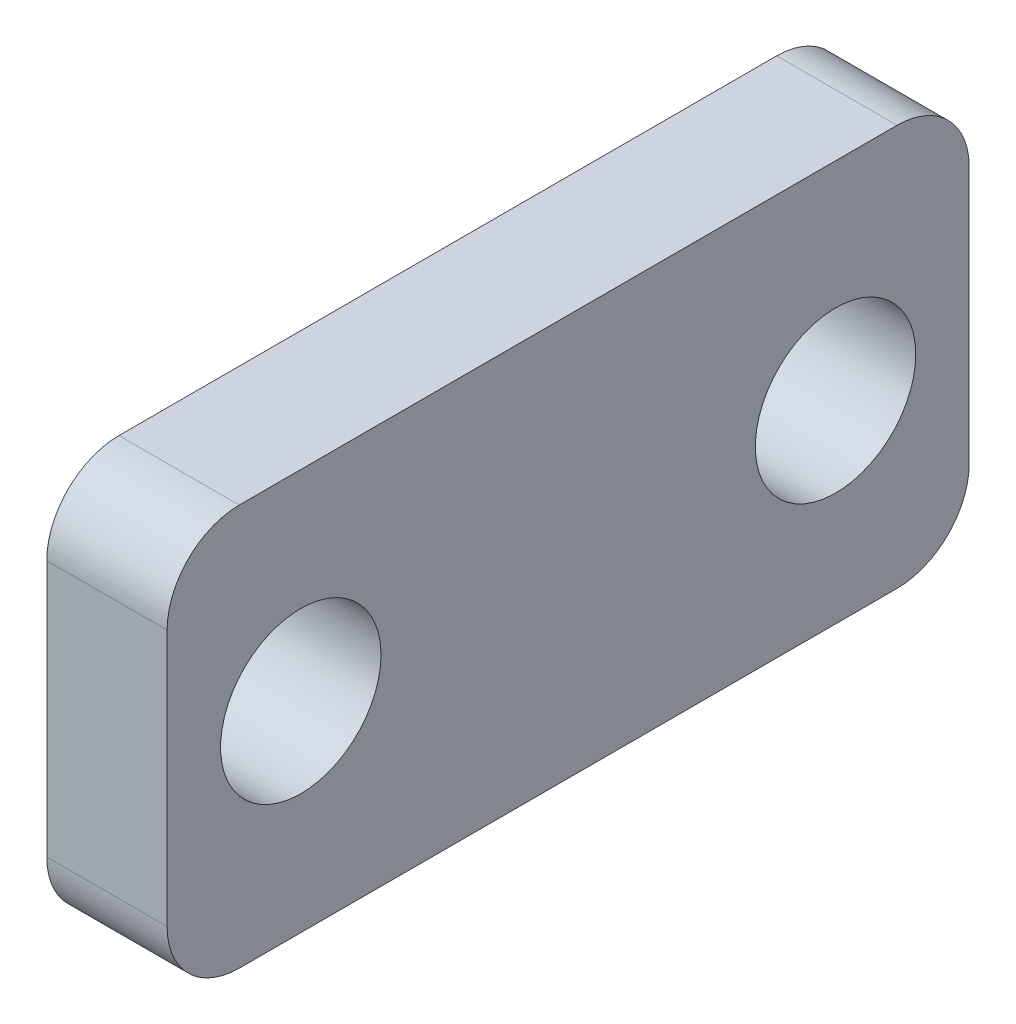
ISO-10303-21;
HEADER;
FILE_DESCRIPTION(('STEP AP214'),'2;1');
FILE_NAME('part.step','',(''),(''),'','','');
FILE_SCHEMA(('AUTOMOTIVE_DESIGN { 1 0 10303 214 1 1 1 1 }'));
ENDSEC;
DATA;
#1=APPLICATION_CONTEXT('core data for automotive mechanical design processes');
#2=APPLICATION_PROTOCOL_DEFINITION('international standard','automotive_design',2000,#1);
#3=PRODUCT_CONTEXT('',#1,'mechanical');
#4=PRODUCT('Part','Part','',(#3));
#5=PRODUCT_RELATED_PRODUCT_CATEGORY('part','',(#4));
#6=PRODUCT_DEFINITION_FORMATION('','',#4);
#7=PRODUCT_DEFINITION_CONTEXT('part definition',#1,'design');
#8=PRODUCT_DEFINITION('design','',#6,#7);
#9=PRODUCT_DEFINITION_SHAPE('','',#8);
#10=(LENGTH_UNIT() NAMED_UNIT(*) SI_UNIT(.MILLI.,.METRE.));
#11=(NAMED_UNIT(*) PLANE_ANGLE_UNIT() SI_UNIT($,.RADIAN.));
#12=(NAMED_UNIT(*) SI_UNIT($,.STERADIAN.) SOLID_ANGLE_UNIT());
#13=UNCERTAINTY_MEASURE_WITH_UNIT(LENGTH_MEASURE(1.E-05),#10,'distance_accuracy_value','');
#14=(GEOMETRIC_REPRESENTATION_CONTEXT(3) GLOBAL_UNCERTAINTY_ASSIGNED_CONTEXT((#13)) GLOBAL_UNIT_ASSIGNED_CONTEXT((#10,
#11,#12)) REPRESENTATION_CONTEXT('',''));
#15=CARTESIAN_POINT('',(0.,0.,0.));
#16=DIRECTION('',(0.,0.,1.));
#17=DIRECTION('',(1.,0.,0.));
#18=AXIS2_PLACEMENT_3D('',#15,#16,#17);
#19=CARTESIAN_POINT('',(45.,-48.,123.));
#20=DIRECTION('',(-1.,0.,0.));
#21=DIRECTION('',(0.,0.,1.));
#22=AXIS2_PLACEMENT_3D('',#19,#20,#21);
#23=CYLINDRICAL_SURFACE('',#22,27.);
#24=CARTESIAN_POINT('',(0.,-48.,123.));
#25=DIRECTION('',(1.,0.,0.));
#26=DIRECTION('',(0.,0.,1.));
#27=AXIS2_PLACEMENT_3D('',#24,#25,#26);
#28=CIRCLE('',#27,27.);
#29=CARTESIAN_POINT('',(0.,-47.9999999999998,150.));
#30=VERTEX_POINT('',#29);
#31=CARTESIAN_POINT('',(0.,-75.,123.));
#32=VERTEX_POINT('',#31);
#33=EDGE_CURVE('E137',#30,#32,#28,.T.);
#34=ORIENTED_EDGE('',*,*,#33,.T.);
#35=DIRECTION('',(-1.,0.,0.));
#36=VECTOR('',#35,1.);
#37=CARTESIAN_POINT('',(45.,-75.,123.));
#38=LINE('',#37,#36);
#39=CARTESIAN_POINT('',(45.,-75.,123.));
#40=VERTEX_POINT('',#39);
#41=EDGE_CURVE('E11',#40,#32,#38,.T.);
#42=ORIENTED_EDGE('',*,*,#41,.F.);
#43=CARTESIAN_POINT('',(45.,-48.,123.));
#44=DIRECTION('',(1.,0.,0.));
#45=DIRECTION('',(0.,0.,1.));
#46=AXIS2_PLACEMENT_3D('',#43,#44,#45);
#47=CIRCLE('',#46,27.);
#48=CARTESIAN_POINT('',(45.,-47.9999999999998,150.));
#49=VERTEX_POINT('',#48);
#50=EDGE_CURVE('E152',#49,#40,#47,.T.);
#51=ORIENTED_EDGE('',*,*,#50,.F.);
#52=DIRECTION('',(-1.,0.,0.));
#53=VECTOR('',#52,1.);
#54=CARTESIAN_POINT('',(45.,-47.9999999999998,150.));
#55=LINE('',#54,#53);
#56=EDGE_CURVE('E133',#49,#30,#55,.T.);
#57=ORIENTED_EDGE('',*,*,#56,.T.);
#58=EDGE_LOOP('',(#34,#42,#51,#57));
#59=FACE_BOUND('',#58,.T.);
#60=ADVANCED_FACE('F41',(#59),#23,.T.);
#61=CARTESIAN_POINT('',(45.,-75.,123.));
#62=DIRECTION('',(0.,1.,0.));
#63=DIRECTION('',(0.,0.,1.));
#64=AXIS2_PLACEMENT_3D('',#61,#62,#63);
#65=PLANE('',#64);
#66=DIRECTION('',(0.,0.,-1.));
#67=VECTOR('',#66,1.);
#68=CARTESIAN_POINT('',(0.,-75.,123.));
#69=LINE('',#68,#67);
#70=CARTESIAN_POINT('',(0.,-75.,-123.));
#71=VERTEX_POINT('',#70);
#72=EDGE_CURVE('E140',#32,#71,#69,.T.);
#73=ORIENTED_EDGE('',*,*,#72,.T.);
#74=DIRECTION('',(-1.,0.,0.));
#75=VECTOR('',#74,1.);
#76=CARTESIAN_POINT('',(45.,-75.,-123.));
#77=LINE('',#76,#75);
#78=CARTESIAN_POINT('',(45.,-75.,-123.));
#79=VERTEX_POINT('',#78);
#80=EDGE_CURVE('E49',#79,#71,#77,.T.);
#81=ORIENTED_EDGE('',*,*,#80,.F.);
#82=DIRECTION('',(0.,0.,-1.));
#83=VECTOR('',#82,1.);
#84=CARTESIAN_POINT('',(45.,-75.,123.));
#85=LINE('',#84,#83);
#86=EDGE_CURVE('E100',#40,#79,#85,.T.);
#87=ORIENTED_EDGE('',*,*,#86,.F.);
#88=ORIENTED_EDGE('',*,*,#41,.T.);
#89=EDGE_LOOP('',(#73,#81,#87,#88));
#90=FACE_BOUND('',#89,.T.);
#91=ADVANCED_FACE('F221',(#90),#65,.F.);
#92=CARTESIAN_POINT('',(45.,-48.,-123.));
#93=DIRECTION('',(-1.,0.,0.));
#94=DIRECTION('',(0.,0.,1.));
#95=AXIS2_PLACEMENT_3D('',#92,#93,#94);
#96=CYLINDRICAL_SURFACE('',#95,27.);
#97=CARTESIAN_POINT('',(0.,-48.,-123.));
#98=DIRECTION('',(1.,0.,0.));
#99=DIRECTION('',(0.,0.,-1.));
#100=AXIS2_PLACEMENT_3D('',#97,#98,#99);
#101=CIRCLE('',#100,27.);
#102=CARTESIAN_POINT('',(0.,-48.,-150.));
#103=VERTEX_POINT('',#102);
#104=EDGE_CURVE('E143',#71,#103,#101,.T.);
#105=ORIENTED_EDGE('',*,*,#104,.T.);
#106=DIRECTION('',(-1.,0.,0.));
#107=VECTOR('',#106,1.);
#108=CARTESIAN_POINT('',(45.,-48.,-150.));
#109=LINE('',#108,#107);
#110=CARTESIAN_POINT('',(45.,-48.,-150.));
#111=VERTEX_POINT('',#110);
#112=EDGE_CURVE('E159',#111,#103,#109,.T.);
#113=ORIENTED_EDGE('',*,*,#112,.F.);
#114=CARTESIAN_POINT('',(45.,-48.,-123.));
#115=DIRECTION('',(1.,0.,0.));
#116=DIRECTION('',(0.,0.,-1.));
#117=AXIS2_PLACEMENT_3D('',#114,#115,#116);
#118=CIRCLE('',#117,27.);
#119=EDGE_CURVE('E167',#79,#111,#118,.T.);
#120=ORIENTED_EDGE('',*,*,#119,.F.);
#121=ORIENTED_EDGE('',*,*,#80,.T.);
#122=EDGE_LOOP('',(#105,#113,#120,#121));
#123=FACE_BOUND('',#122,.T.);
#124=ADVANCED_FACE('F165',(#123),#96,.T.);
#125=CARTESIAN_POINT('',(45.,47.9999999999998,-150.));
#126=DIRECTION('',(0.,0.,1.));
#127=DIRECTION('',(1.,0.,0.));
#128=AXIS2_PLACEMENT_3D('',#125,#126,#127);
#129=PLANE('',#128);
#130=DIRECTION('',(0.,1.,0.));
#131=VECTOR('',#130,1.);
#132=CARTESIAN_POINT('',(0.,47.9999999999998,-150.));
#133=LINE('',#132,#131);
#134=CARTESIAN_POINT('',(0.,47.9999999999998,-150.));
#135=VERTEX_POINT('',#134);
#136=EDGE_CURVE('E145',#103,#135,#133,.T.);
#137=ORIENTED_EDGE('',*,*,#136,.T.);
#138=DIRECTION('',(-1.,0.,0.));
#139=VECTOR('',#138,1.);
#140=CARTESIAN_POINT('',(45.,47.9999999999998,-150.));
#141=LINE('',#140,#139);
#142=CARTESIAN_POINT('',(45.,47.9999999999998,-150.));
#143=VERTEX_POINT('',#142);
#144=EDGE_CURVE('E156',#143,#135,#141,.T.);
#145=ORIENTED_EDGE('',*,*,#144,.F.);
#146=DIRECTION('',(0.,1.,0.));
#147=VECTOR('',#146,1.);
#148=CARTESIAN_POINT('',(45.,47.9999999999998,-150.));
#149=LINE('',#148,#147);
#150=EDGE_CURVE('E179',#111,#143,#149,.T.);
#151=ORIENTED_EDGE('',*,*,#150,.F.);
#152=ORIENTED_EDGE('',*,*,#112,.T.);
#153=EDGE_LOOP('',(#137,#145,#151,#152));
#154=FACE_BOUND('',#153,.T.);
#155=ADVANCED_FACE('F175',(#154),#129,.F.);
#156=CARTESIAN_POINT('',(45.,48.,-123.));
#157=DIRECTION('',(-1.,0.,0.));
#158=DIRECTION('',(0.,0.,1.));
#159=AXIS2_PLACEMENT_3D('',#156,#157,#158);
#160=CYLINDRICAL_SURFACE('',#159,27.);
#161=CARTESIAN_POINT('',(0.,48.,-123.));
#162=DIRECTION('',(1.,0.,0.));
#163=DIRECTION('',(0.,0.,-1.));
#164=AXIS2_PLACEMENT_3D('',#161,#162,#163);
#165=CIRCLE('',#164,27.);
#166=CARTESIAN_POINT('',(0.,75.,-123.));
#167=VERTEX_POINT('',#166);
#168=EDGE_CURVE('E147',#135,#167,#165,.T.);
#169=ORIENTED_EDGE('',*,*,#168,.T.);
#170=DIRECTION('',(-1.,0.,0.));
#171=VECTOR('',#170,1.);
#172=CARTESIAN_POINT('',(45.,75.,-123.));
#173=LINE('',#172,#171);
#174=CARTESIAN_POINT('',(45.,75.,-123.));
#175=VERTEX_POINT('',#174);
#176=EDGE_CURVE('E128',#175,#167,#173,.T.);
#177=ORIENTED_EDGE('',*,*,#176,.F.);
#178=CARTESIAN_POINT('',(45.,48.,-123.));
#179=DIRECTION('',(1.,0.,0.));
#180=DIRECTION('',(0.,0.,-1.));
#181=AXIS2_PLACEMENT_3D('',#178,#179,#180);
#182=CIRCLE('',#181,27.);
#183=EDGE_CURVE('E119',#143,#175,#182,.T.);
#184=ORIENTED_EDGE('',*,*,#183,.F.);
#185=ORIENTED_EDGE('',*,*,#144,.T.);
#186=EDGE_LOOP('',(#169,#177,#184,#185));
#187=FACE_BOUND('',#186,.T.);
#188=ADVANCED_FACE('F178',(#187),#160,.T.);
#189=CARTESIAN_POINT('',(45.,75.,123.));
#190=DIRECTION('',(0.,-1.,0.));
#191=DIRECTION('',(0.,0.,-1.));
#192=AXIS2_PLACEMENT_3D('',#189,#190,#191);
#193=PLANE('',#192);
#194=DIRECTION('',(0.,0.,1.));
#195=VECTOR('',#194,1.);
#196=CARTESIAN_POINT('',(0.,75.,123.));
#197=LINE('',#196,#195);
#198=CARTESIAN_POINT('',(0.,75.,123.));
#199=VERTEX_POINT('',#198);
#200=EDGE_CURVE('E127',#167,#199,#197,.T.);
#201=ORIENTED_EDGE('',*,*,#200,.T.);
#202=DIRECTION('',(-1.,0.,0.));
#203=VECTOR('',#202,1.);
#204=CARTESIAN_POINT('',(45.,75.,123.));
#205=LINE('',#204,#203);
#206=CARTESIAN_POINT('',(45.,75.,123.));
#207=VERTEX_POINT('',#206);
#208=EDGE_CURVE('E124',#207,#199,#205,.T.);
#209=ORIENTED_EDGE('',*,*,#208,.F.);
#210=DIRECTION('',(0.,0.,1.));
#211=VECTOR('',#210,1.);
#212=CARTESIAN_POINT('',(45.,75.,123.));
#213=LINE('',#212,#211);
#214=EDGE_CURVE('E113',#175,#207,#213,.T.);
#215=ORIENTED_EDGE('',*,*,#214,.F.);
#216=ORIENTED_EDGE('',*,*,#176,.T.);
#217=EDGE_LOOP('',(#201,#209,#215,#216));
#218=FACE_BOUND('',#217,.T.);
#219=ADVANCED_FACE('F125',(#218),#193,.F.);
#220=CARTESIAN_POINT('',(45.,48.,123.));
#221=DIRECTION('',(-1.,0.,0.));
#222=DIRECTION('',(0.,0.,1.));
#223=AXIS2_PLACEMENT_3D('',#220,#221,#222);
#224=CYLINDRICAL_SURFACE('',#223,27.);
#225=CARTESIAN_POINT('',(0.,48.,123.));
#226=DIRECTION('',(1.,0.,0.));
#227=DIRECTION('',(0.,0.,1.));
#228=AXIS2_PLACEMENT_3D('',#225,#226,#227);
#229=CIRCLE('',#228,27.);
#230=CARTESIAN_POINT('',(0.,47.9999999999998,150.));
#231=VERTEX_POINT('',#230);
#232=EDGE_CURVE('E86',#199,#231,#229,.T.);
#233=ORIENTED_EDGE('',*,*,#232,.T.);
#234=DIRECTION('',(-1.,0.,0.));
#235=VECTOR('',#234,1.);
#236=CARTESIAN_POINT('',(45.,47.9999999999998,150.));
#237=LINE('',#236,#235);
#238=CARTESIAN_POINT('',(45.,47.9999999999998,150.));
#239=VERTEX_POINT('',#238);
#240=EDGE_CURVE('E129',#239,#231,#237,.T.);
#241=ORIENTED_EDGE('',*,*,#240,.F.);
#242=CARTESIAN_POINT('',(45.,48.,123.));
#243=DIRECTION('',(1.,0.,0.));
#244=DIRECTION('',(0.,0.,1.));
#245=AXIS2_PLACEMENT_3D('',#242,#243,#244);
#246=CIRCLE('',#245,27.);
#247=EDGE_CURVE('E117',#207,#239,#246,.T.);
#248=ORIENTED_EDGE('',*,*,#247,.F.);
#249=ORIENTED_EDGE('',*,*,#208,.T.);
#250=EDGE_LOOP('',(#233,#241,#248,#249));
#251=FACE_BOUND('',#250,.T.);
#252=ADVANCED_FACE('F131',(#251),#224,.T.);
#253=CARTESIAN_POINT('',(45.,47.9999999999998,150.));
#254=DIRECTION('',(0.,0.,-1.));
#255=DIRECTION('',(0.,1.,0.));
#256=AXIS2_PLACEMENT_3D('',#253,#254,#255);
#257=PLANE('',#256);
#258=DIRECTION('',(0.,-1.,0.));
#259=VECTOR('',#258,1.);
#260=CARTESIAN_POINT('',(0.,47.9999999999998,150.));
#261=LINE('',#260,#259);
#262=EDGE_CURVE('E92',#231,#30,#261,.T.);
#263=ORIENTED_EDGE('',*,*,#262,.T.);
#264=ORIENTED_EDGE('',*,*,#56,.F.);
#265=DIRECTION('',(0.,-1.,0.));
#266=VECTOR('',#265,1.);
#267=CARTESIAN_POINT('',(45.,47.9999999999998,150.));
#268=LINE('',#267,#266);
#269=EDGE_CURVE('E57',#239,#49,#268,.T.);
#270=ORIENTED_EDGE('',*,*,#269,.F.);
#271=ORIENTED_EDGE('',*,*,#240,.T.);
#272=EDGE_LOOP('',(#263,#264,#270,#271));
#273=FACE_BOUND('',#272,.T.);
#274=ADVANCED_FACE('F208',(#273),#257,.F.);
#275=CARTESIAN_POINT('',(45.,-48.,123.));
#276=DIRECTION('',(-1.,0.,0.));
#277=DIRECTION('',(0.,0.,1.));
#278=AXIS2_PLACEMENT_3D('',#275,#276,#277);
#279=PLANE('',#278);
#280=CARTESIAN_POINT('',(45.,0.,100.));
#281=DIRECTION('',(1.,0.,0.));
#282=DIRECTION('',(0.,0.,-1.));
#283=AXIS2_PLACEMENT_3D('',#280,#281,#282);
#284=CIRCLE('',#283,30.);
#285=CARTESIAN_POINT('',(45.,0.,70.));
#286=VERTEX_POINT('',#285);
#287=EDGE_CURVE('E191',#286,#286,#284,.T.);
#288=ORIENTED_EDGE('',*,*,#287,.F.);
#289=EDGE_LOOP('',(#288));
#290=FACE_BOUND('',#289,.T.);
#291=CARTESIAN_POINT('',(45.,-2.63415060311445,-100.));
#292=DIRECTION('',(1.,0.,0.));
#293=DIRECTION('',(0.,0.,-1.));
#294=AXIS2_PLACEMENT_3D('',#291,#292,#293);
#295=CIRCLE('',#294,30.);
#296=CARTESIAN_POINT('',(45.,-2.63415060311445,-130.));
#297=VERTEX_POINT('',#296);
#298=EDGE_CURVE('E185',#297,#297,#295,.T.);
#299=ORIENTED_EDGE('',*,*,#298,.F.);
#300=EDGE_LOOP('',(#299));
#301=FACE_BOUND('',#300,.T.);
#302=ORIENTED_EDGE('',*,*,#50,.T.);
#303=ORIENTED_EDGE('',*,*,#86,.T.);
#304=ORIENTED_EDGE('',*,*,#119,.T.);
#305=ORIENTED_EDGE('',*,*,#150,.T.);
#306=ORIENTED_EDGE('',*,*,#183,.T.);
#307=ORIENTED_EDGE('',*,*,#214,.T.);
#308=ORIENTED_EDGE('',*,*,#247,.T.);
#309=ORIENTED_EDGE('',*,*,#269,.T.);
#310=EDGE_LOOP('',(#302,#303,#304,#305,#306,#307,#308,#309));
#311=FACE_BOUND('',#310,.T.);
#312=ADVANCED_FACE('F115',(#290,#301,#311),#279,.F.);
#313=CARTESIAN_POINT('',(0.,-48.,123.));
#314=DIRECTION('',(-1.,0.,0.));
#315=DIRECTION('',(0.,0.,1.));
#316=AXIS2_PLACEMENT_3D('',#313,#314,#315);
#317=PLANE('',#316);
#318=CARTESIAN_POINT('',(0.,0.,100.));
#319=DIRECTION('',(1.,0.,0.));
#320=DIRECTION('',(0.,0.,-1.));
#321=AXIS2_PLACEMENT_3D('',#318,#319,#320);
#322=CIRCLE('',#321,30.);
#323=CARTESIAN_POINT('',(0.,0.,70.));
#324=VERTEX_POINT('',#323);
#325=EDGE_CURVE('E141',#324,#324,#322,.T.);
#326=ORIENTED_EDGE('',*,*,#325,.T.);
#327=EDGE_LOOP('',(#326));
#328=FACE_BOUND('',#327,.T.);
#329=CARTESIAN_POINT('',(0.,-2.63415060311445,-100.));
#330=DIRECTION('',(1.,0.,0.));
#331=DIRECTION('',(0.,0.,-1.));
#332=AXIS2_PLACEMENT_3D('',#329,#330,#331);
#333=CIRCLE('',#332,30.);
#334=CARTESIAN_POINT('',(0.,-2.63415060311445,-130.));
#335=VERTEX_POINT('',#334);
#336=EDGE_CURVE('E188',#335,#335,#333,.T.);
#337=ORIENTED_EDGE('',*,*,#336,.T.);
#338=EDGE_LOOP('',(#337));
#339=FACE_BOUND('',#338,.T.);
#340=ORIENTED_EDGE('',*,*,#33,.F.);
#341=ORIENTED_EDGE('',*,*,#262,.F.);
#342=ORIENTED_EDGE('',*,*,#232,.F.);
#343=ORIENTED_EDGE('',*,*,#200,.F.);
#344=ORIENTED_EDGE('',*,*,#168,.F.);
#345=ORIENTED_EDGE('',*,*,#136,.F.);
#346=ORIENTED_EDGE('',*,*,#104,.F.);
#347=ORIENTED_EDGE('',*,*,#72,.F.);
#348=EDGE_LOOP('',(#340,#341,#342,#343,#344,#345,#346,#347));
#349=FACE_BOUND('',#348,.T.);
#350=ADVANCED_FACE('F171',(#328,#339,#349),#317,.T.);
#351=CARTESIAN_POINT('',(0.,-2.63415060311445,-100.));
#352=DIRECTION('',(1.,0.,0.));
#353=DIRECTION('',(0.,0.,-1.));
#354=AXIS2_PLACEMENT_3D('',#351,#352,#353);
#355=CYLINDRICAL_SURFACE('',#354,30.);
#356=CARTESIAN_POINT('',(0.,-2.63415060311445,-130.));
#357=CARTESIAN_POINT('',(0.468749999999999,-2.63415060311445,-130.));
#358=CARTESIAN_POINT('',(0.9375,-2.63415060311445,-130.));
#359=CARTESIAN_POINT('',(1.875,-2.63415060311445,-130.));
#360=CARTESIAN_POINT('',(2.34375,-2.63415060311445,-130.));
#361=CARTESIAN_POINT('',(3.28125,-2.63415060311445,-130.));
#362=CARTESIAN_POINT('',(3.75,-2.63415060311445,-130.));
#363=CARTESIAN_POINT('',(4.6875,-2.63415060311445,-130.));
#364=CARTESIAN_POINT('',(5.15625,-2.63415060311445,-130.));
#365=CARTESIAN_POINT('',(6.09375,-2.63415060311445,-130.));
#366=CARTESIAN_POINT('',(6.5625,-2.63415060311445,-130.));
#367=CARTESIAN_POINT('',(7.5,-2.63415060311445,-130.));
#368=CARTESIAN_POINT('',(7.96875,-2.63415060311445,-130.));
#369=CARTESIAN_POINT('',(8.90625,-2.63415060311445,-130.));
#370=CARTESIAN_POINT('',(9.375,-2.63415060311445,-130.));
#371=CARTESIAN_POINT('',(10.3125,-2.63415060311445,-130.));
#372=CARTESIAN_POINT('',(10.78125,-2.63415060311445,-130.));
#373=CARTESIAN_POINT('',(11.71875,-2.63415060311445,-130.));
#374=CARTESIAN_POINT('',(12.1875,-2.63415060311445,-130.));
#375=CARTESIAN_POINT('',(13.125,-2.63415060311445,-130.));
#376=CARTESIAN_POINT('',(13.59375,-2.63415060311445,-130.));
#377=CARTESIAN_POINT('',(14.53125,-2.63415060311445,-130.));
#378=CARTESIAN_POINT('',(15.,-2.63415060311445,-130.));
#379=CARTESIAN_POINT('',(15.9375,-2.63415060311445,-130.));
#380=CARTESIAN_POINT('',(16.40625,-2.63415060311445,-130.));
#381=CARTESIAN_POINT('',(17.34375,-2.63415060311445,-130.));
#382=CARTESIAN_POINT('',(17.8125,-2.63415060311445,-130.));
#383=CARTESIAN_POINT('',(18.75,-2.63415060311445,-130.));
#384=CARTESIAN_POINT('',(19.21875,-2.63415060311445,-130.));
#385=CARTESIAN_POINT('',(20.15625,-2.63415060311445,-130.));
#386=CARTESIAN_POINT('',(20.625,-2.63415060311445,-130.));
#387=CARTESIAN_POINT('',(21.5625,-2.63415060311445,-130.));
#388=CARTESIAN_POINT('',(22.03125,-2.63415060311445,-130.));
#389=CARTESIAN_POINT('',(22.96875,-2.63415060311445,-130.));
#390=CARTESIAN_POINT('',(23.4375,-2.63415060311445,-130.));
#391=CARTESIAN_POINT('',(24.375,-2.63415060311445,-130.));
#392=CARTESIAN_POINT('',(24.84375,-2.63415060311445,-130.));
#393=CARTESIAN_POINT('',(25.78125,-2.63415060311445,-130.));
#394=CARTESIAN_POINT('',(26.25,-2.63415060311445,-130.));
#395=CARTESIAN_POINT('',(27.1875,-2.63415060311445,-130.));
#396=CARTESIAN_POINT('',(27.65625,-2.63415060311445,-130.));
#397=CARTESIAN_POINT('',(28.59375,-2.63415060311445,-130.));
#398=CARTESIAN_POINT('',(29.0625,-2.63415060311445,-130.));
#399=CARTESIAN_POINT('',(30.,-2.63415060311445,-130.));
#400=CARTESIAN_POINT('',(30.46875,-2.63415060311445,-130.));
#401=CARTESIAN_POINT('',(31.40625,-2.63415060311445,-130.));
#402=CARTESIAN_POINT('',(31.875,-2.63415060311445,-130.));
#403=CARTESIAN_POINT('',(32.8125,-2.63415060311445,-130.));
#404=CARTESIAN_POINT('',(33.28125,-2.63415060311445,-130.));
#405=CARTESIAN_POINT('',(34.21875,-2.63415060311445,-130.));
#406=CARTESIAN_POINT('',(34.6875,-2.63415060311445,-130.));
#407=CARTESIAN_POINT('',(35.625,-2.63415060311445,-130.));
#408=CARTESIAN_POINT('',(36.09375,-2.63415060311445,-130.));
#409=CARTESIAN_POINT('',(37.03125,-2.63415060311445,-130.));
#410=CARTESIAN_POINT('',(37.5,-2.63415060311445,-130.));
#411=CARTESIAN_POINT('',(38.4375,-2.63415060311445,-130.));
#412=CARTESIAN_POINT('',(38.90625,-2.63415060311445,-130.));
#413=CARTESIAN_POINT('',(39.84375,-2.63415060311445,-130.));
#414=CARTESIAN_POINT('',(40.3125,-2.63415060311445,-130.));
#415=CARTESIAN_POINT('',(41.25,-2.63415060311445,-130.));
#416=CARTESIAN_POINT('',(41.71875,-2.63415060311445,-130.));
#417=CARTESIAN_POINT('',(42.65625,-2.63415060311445,-130.));
#418=CARTESIAN_POINT('',(43.125,-2.63415060311445,-130.));
#419=CARTESIAN_POINT('',(44.0625,-2.63415060311445,-130.));
#420=CARTESIAN_POINT('',(44.53125,-2.63415060311445,-130.));
#421=CARTESIAN_POINT('',(45.,-2.63415060311445,-130.));
#422=B_SPLINE_CURVE_WITH_KNOTS('',3,(#356,#357,#358,#359,#360,#361,#362,#363,#364,#365,#366,
#367,#368,#369,#370,#371,#372,#373,#374,#375,#376,#377,#378,#379,#380,#381,#382,#383,#384,#385,
#386,#387,#388,#389,#390,#391,#392,#393,#394,#395,#396,#397,#398,#399,#400,#401,#402,#403,#404,
#405,#406,#407,#408,#409,#410,#411,#412,#413,#414,#415,#416,#417,#418,#419,#420,#421),
.UNSPECIFIED.,.F.,.F.,(4,2,2,2,2,2,2,2,2,2,2,2,2,2,2,2,2,2,2,2,2,2,2,2,2,2,2,2,2,2,2,2,4),(0.,
1.40625,2.8125,4.21875,5.625,7.03125,8.4375,9.84375,11.25,12.65625,14.0625,15.46875,16.875,
18.28125,19.6875,21.09375,22.5,23.90625,25.3125,26.71875,28.125,29.53125,30.9375,32.34375,33.75,
35.15625,36.5625,37.96875,39.375,40.78125,42.1875,43.59375,45.),.UNSPECIFIED.);
#423=EDGE_CURVE('BSEAM202',#335,#297,#422,.T.);
#424=ORIENTED_EDGE('',*,*,#336,.F.);
#425=ORIENTED_EDGE('',*,*,#298,.T.);
#426=ORIENTED_EDGE('',*,*,#423,.T.);
#427=ORIENTED_EDGE('',*,*,#423,.F.);
#428=EDGE_LOOP('',(#424,#426,#425,#427));
#429=FACE_BOUND('',#428,.T.);
#430=ADVANCED_FACE('F202',(#429),#355,.F.);
#431=CARTESIAN_POINT('',(0.,0.,100.));
#432=DIRECTION('',(1.,0.,0.));
#433=DIRECTION('',(0.,0.,-1.));
#434=AXIS2_PLACEMENT_3D('',#431,#432,#433);
#435=CYLINDRICAL_SURFACE('',#434,30.);
#436=CARTESIAN_POINT('',(0.,0.,70.));
#437=CARTESIAN_POINT('',(0.468749999999999,0.,70.));
#438=CARTESIAN_POINT('',(0.9375,0.,70.));
#439=CARTESIAN_POINT('',(1.875,0.,70.));
#440=CARTESIAN_POINT('',(2.34375,0.,70.));
#441=CARTESIAN_POINT('',(3.28125,0.,70.));
#442=CARTESIAN_POINT('',(3.75,0.,70.));
#443=CARTESIAN_POINT('',(4.6875,0.,70.));
#444=CARTESIAN_POINT('',(5.15625,0.,70.));
#445=CARTESIAN_POINT('',(6.09375,0.,70.));
#446=CARTESIAN_POINT('',(6.5625,0.,70.));
#447=CARTESIAN_POINT('',(7.5,0.,70.));
#448=CARTESIAN_POINT('',(7.96875,0.,70.));
#449=CARTESIAN_POINT('',(8.90625,0.,70.));
#450=CARTESIAN_POINT('',(9.375,0.,70.));
#451=CARTESIAN_POINT('',(10.3125,0.,70.));
#452=CARTESIAN_POINT('',(10.78125,0.,70.));
#453=CARTESIAN_POINT('',(11.71875,0.,70.));
#454=CARTESIAN_POINT('',(12.1875,0.,70.));
#455=CARTESIAN_POINT('',(13.125,0.,70.));
#456=CARTESIAN_POINT('',(13.59375,0.,70.));
#457=CARTESIAN_POINT('',(14.53125,0.,70.));
#458=CARTESIAN_POINT('',(15.,0.,70.));
#459=CARTESIAN_POINT('',(15.9375,0.,70.));
#460=CARTESIAN_POINT('',(16.40625,0.,70.));
#461=CARTESIAN_POINT('',(17.34375,0.,70.));
#462=CARTESIAN_POINT('',(17.8125,0.,70.));
#463=CARTESIAN_POINT('',(18.75,0.,70.));
#464=CARTESIAN_POINT('',(19.21875,0.,70.));
#465=CARTESIAN_POINT('',(20.15625,0.,70.));
#466=CARTESIAN_POINT('',(20.625,0.,70.));
#467=CARTESIAN_POINT('',(21.5625,0.,70.));
#468=CARTESIAN_POINT('',(22.03125,0.,70.));
#469=CARTESIAN_POINT('',(22.96875,0.,70.));
#470=CARTESIAN_POINT('',(23.4375,0.,70.));
#471=CARTESIAN_POINT('',(24.375,0.,70.));
#472=CARTESIAN_POINT('',(24.84375,0.,70.));
#473=CARTESIAN_POINT('',(25.78125,0.,70.));
#474=CARTESIAN_POINT('',(26.25,0.,70.));
#475=CARTESIAN_POINT('',(27.1875,0.,70.));
#476=CARTESIAN_POINT('',(27.65625,0.,70.));
#477=CARTESIAN_POINT('',(28.59375,0.,70.));
#478=CARTESIAN_POINT('',(29.0625,0.,70.));
#479=CARTESIAN_POINT('',(30.,0.,70.));
#480=CARTESIAN_POINT('',(30.46875,0.,70.));
#481=CARTESIAN_POINT('',(31.40625,0.,70.));
#482=CARTESIAN_POINT('',(31.875,0.,70.));
#483=CARTESIAN_POINT('',(32.8125,0.,70.));
#484=CARTESIAN_POINT('',(33.28125,0.,70.));
#485=CARTESIAN_POINT('',(34.21875,0.,70.));
#486=CARTESIAN_POINT('',(34.6875,0.,70.));
#487=CARTESIAN_POINT('',(35.625,0.,70.));
#488=CARTESIAN_POINT('',(36.09375,0.,70.));
#489=CARTESIAN_POINT('',(37.03125,0.,70.));
#490=CARTESIAN_POINT('',(37.5,0.,70.));
#491=CARTESIAN_POINT('',(38.4375,0.,70.));
#492=CARTESIAN_POINT('',(38.90625,0.,70.));
#493=CARTESIAN_POINT('',(39.84375,0.,70.));
#494=CARTESIAN_POINT('',(40.3125,0.,70.));
#495=CARTESIAN_POINT('',(41.25,0.,70.));
#496=CARTESIAN_POINT('',(41.71875,0.,70.));
#497=CARTESIAN_POINT('',(42.65625,0.,70.));
#498=CARTESIAN_POINT('',(43.125,0.,70.));
#499=CARTESIAN_POINT('',(44.0625,0.,70.));
#500=CARTESIAN_POINT('',(44.53125,0.,70.));
#501=CARTESIAN_POINT('',(45.,0.,70.));
#502=B_SPLINE_CURVE_WITH_KNOTS('',3,(#436,#437,#438,#439,#440,#441,#442,#443,#444,#445,#446,
#447,#448,#449,#450,#451,#452,#453,#454,#455,#456,#457,#458,#459,#460,#461,#462,#463,#464,#465,
#466,#467,#468,#469,#470,#471,#472,#473,#474,#475,#476,#477,#478,#479,#480,#481,#482,#483,#484,
#485,#486,#487,#488,#489,#490,#491,#492,#493,#494,#495,#496,#497,#498,#499,#500,#501),
.UNSPECIFIED.,.F.,.F.,(4,2,2,2,2,2,2,2,2,2,2,2,2,2,2,2,2,2,2,2,2,2,2,2,2,2,2,2,2,2,2,2,4),(0.,
1.40625,2.8125,4.21875,5.625,7.03125,8.4375,9.84375,11.25,12.65625,14.0625,15.46875,16.875,
18.28125,19.6875,21.09375,22.5,23.90625,25.3125,26.71875,28.125,29.53125,30.9375,32.34375,33.75,
35.15625,36.5625,37.96875,39.375,40.78125,42.1875,43.59375,45.),.UNSPECIFIED.);
#503=EDGE_CURVE('BSEAM199',#324,#286,#502,.T.);
#504=ORIENTED_EDGE('',*,*,#325,.F.);
#505=ORIENTED_EDGE('',*,*,#287,.T.);
#506=ORIENTED_EDGE('',*,*,#503,.T.);
#507=ORIENTED_EDGE('',*,*,#503,.F.);
#508=EDGE_LOOP('',(#504,#506,#505,#507));
#509=FACE_BOUND('',#508,.T.);
#510=ADVANCED_FACE('F199',(#509),#435,.F.);
#511=CLOSED_SHELL('',(#60,#91,#124,#155,#188,#219,#252,#274,#312,#350,#430,#510));
#512=MANIFOLD_SOLID_BREP('B2',#511);
#513=ADVANCED_BREP_SHAPE_REPRESENTATION('',(#18,#512),#14);
#514=SHAPE_DEFINITION_REPRESENTATION(#9,#513);
ENDSEC;
END-ISO-10303-21;
